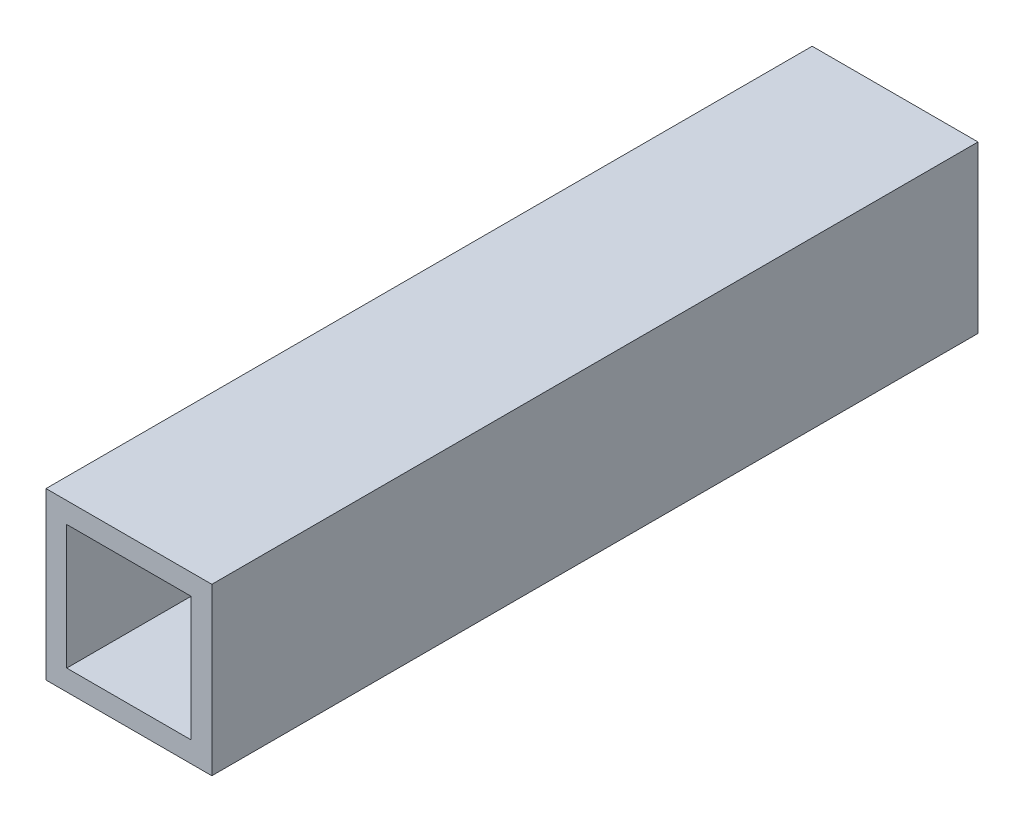
ISO-10303-21;
HEADER;
FILE_DESCRIPTION(('STEP AP214'),'2;1');
FILE_NAME('part.step','',(''),(''),'','','');
FILE_SCHEMA(('AUTOMOTIVE_DESIGN { 1 0 10303 214 1 1 1 1 }'));
ENDSEC;
DATA;
#1=APPLICATION_CONTEXT('core data for automotive mechanical design processes');
#2=APPLICATION_PROTOCOL_DEFINITION('international standard','automotive_design',2000,#1);
#3=PRODUCT_CONTEXT('',#1,'mechanical');
#4=PRODUCT('Part','Part','',(#3));
#5=PRODUCT_RELATED_PRODUCT_CATEGORY('part','',(#4));
#6=PRODUCT_DEFINITION_FORMATION('','',#4);
#7=PRODUCT_DEFINITION_CONTEXT('part definition',#1,'design');
#8=PRODUCT_DEFINITION('design','',#6,#7);
#9=PRODUCT_DEFINITION_SHAPE('','',#8);
#10=(LENGTH_UNIT() NAMED_UNIT(*) SI_UNIT(.MILLI.,.METRE.));
#11=(NAMED_UNIT(*) PLANE_ANGLE_UNIT() SI_UNIT($,.RADIAN.));
#12=(NAMED_UNIT(*) SI_UNIT($,.STERADIAN.) SOLID_ANGLE_UNIT());
#13=UNCERTAINTY_MEASURE_WITH_UNIT(LENGTH_MEASURE(1.E-05),#10,'distance_accuracy_value','');
#14=(GEOMETRIC_REPRESENTATION_CONTEXT(3) GLOBAL_UNCERTAINTY_ASSIGNED_CONTEXT((#13)) GLOBAL_UNIT_ASSIGNED_CONTEXT((#10,
#11,#12)) REPRESENTATION_CONTEXT('',''));
#15=CARTESIAN_POINT('',(0.,0.,0.));
#16=DIRECTION('',(0.,0.,1.));
#17=DIRECTION('',(1.,0.,0.));
#18=AXIS2_PLACEMENT_3D('',#15,#16,#17);
#19=CARTESIAN_POINT('',(0.,0.,58.674));
#20=DIRECTION('',(0.,0.,1.));
#21=DIRECTION('',(1.,0.,0.));
#22=AXIS2_PLACEMENT_3D('',#19,#20,#21);
#23=PLANE('',#22);
#24=DIRECTION('',(0.,-1.,0.));
#25=VECTOR('',#24,1.);
#26=CARTESIAN_POINT('',(-12.7,-12.7,58.674));
#27=LINE('',#26,#25);
#28=CARTESIAN_POINT('',(-12.7,12.7,58.674));
#29=VERTEX_POINT('',#28);
#30=CARTESIAN_POINT('',(-12.7,-12.7,58.674));
#31=VERTEX_POINT('',#30);
#32=EDGE_CURVE('E117',#29,#31,#27,.T.);
#33=ORIENTED_EDGE('',*,*,#32,.T.);
#34=DIRECTION('',(1.,0.,0.));
#35=VECTOR('',#34,1.);
#36=CARTESIAN_POINT('',(12.7,-12.7,58.674));
#37=LINE('',#36,#35);
#38=CARTESIAN_POINT('',(12.7,-12.7,58.674));
#39=VERTEX_POINT('',#38);
#40=EDGE_CURVE('E176',#31,#39,#37,.T.);
#41=ORIENTED_EDGE('',*,*,#40,.T.);
#42=DIRECTION('',(0.,1.,0.));
#43=VECTOR('',#42,1.);
#44=CARTESIAN_POINT('',(12.7,-12.7,58.674));
#45=LINE('',#44,#43);
#46=CARTESIAN_POINT('',(12.7,12.7,58.674));
#47=VERTEX_POINT('',#46);
#48=EDGE_CURVE('E179',#39,#47,#45,.T.);
#49=ORIENTED_EDGE('',*,*,#48,.T.);
#50=DIRECTION('',(-1.,0.,0.));
#51=VECTOR('',#50,1.);
#52=CARTESIAN_POINT('',(12.7,12.7,58.674));
#53=LINE('',#52,#51);
#54=EDGE_CURVE('E63',#47,#29,#53,.T.);
#55=ORIENTED_EDGE('',*,*,#54,.T.);
#56=EDGE_LOOP('',(#33,#41,#49,#55));
#57=FACE_BOUND('',#56,.T.);
#58=DIRECTION('',(1.,0.,0.));
#59=VECTOR('',#58,1.);
#60=CARTESIAN_POINT('',(9.525,-9.525,58.674));
#61=LINE('',#60,#59);
#62=CARTESIAN_POINT('',(-9.52499999999999,-9.525,58.674));
#63=VERTEX_POINT('',#62);
#64=CARTESIAN_POINT('',(9.525,-9.525,58.674));
#65=VERTEX_POINT('',#64);
#66=EDGE_CURVE('E158',#63,#65,#61,.T.);
#67=ORIENTED_EDGE('',*,*,#66,.F.);
#68=DIRECTION('',(0.,-1.,0.));
#69=VECTOR('',#68,1.);
#70=CARTESIAN_POINT('',(-9.52499999999999,-9.525,58.674));
#71=LINE('',#70,#69);
#72=CARTESIAN_POINT('',(-9.52499999999999,9.525,58.674));
#73=VERTEX_POINT('',#72);
#74=EDGE_CURVE('E113',#73,#63,#71,.T.);
#75=ORIENTED_EDGE('',*,*,#74,.F.);
#76=DIRECTION('',(-1.,0.,0.));
#77=VECTOR('',#76,1.);
#78=CARTESIAN_POINT('',(9.525,9.525,58.674));
#79=LINE('',#78,#77);
#80=CARTESIAN_POINT('',(9.525,9.525,58.674));
#81=VERTEX_POINT('',#80);
#82=EDGE_CURVE('E164',#81,#73,#79,.T.);
#83=ORIENTED_EDGE('',*,*,#82,.F.);
#84=DIRECTION('',(0.,1.,0.));
#85=VECTOR('',#84,1.);
#86=CARTESIAN_POINT('',(9.525,-9.525,58.674));
#87=LINE('',#86,#85);
#88=EDGE_CURVE('E161',#65,#81,#87,.T.);
#89=ORIENTED_EDGE('',*,*,#88,.F.);
#90=EDGE_LOOP('',(#67,#75,#83,#89));
#91=FACE_BOUND('',#90,.T.);
#92=ADVANCED_FACE('F39',(#57,#91),#23,.T.);
#93=CARTESIAN_POINT('',(-12.7,-12.7,58.674));
#94=DIRECTION('',(1.,0.,0.));
#95=DIRECTION('',(0.,0.,-1.));
#96=AXIS2_PLACEMENT_3D('',#93,#94,#95);
#97=PLANE('',#96);
#98=DIRECTION('',(0.,0.,-1.));
#99=VECTOR('',#98,1.);
#100=CARTESIAN_POINT('',(-12.7,12.7,58.674));
#101=LINE('',#100,#99);
#102=CARTESIAN_POINT('',(-12.7,12.7,-58.674));
#103=VERTEX_POINT('',#102);
#104=EDGE_CURVE('E184',#29,#103,#101,.T.);
#105=ORIENTED_EDGE('',*,*,#104,.T.);
#106=DIRECTION('',(0.,-1.,0.));
#107=VECTOR('',#106,1.);
#108=CARTESIAN_POINT('',(-12.7,-12.7,-58.674));
#109=LINE('',#108,#107);
#110=CARTESIAN_POINT('',(-12.7,-12.7,-58.674));
#111=VERTEX_POINT('',#110);
#112=EDGE_CURVE('E140',#103,#111,#109,.T.);
#113=ORIENTED_EDGE('',*,*,#112,.T.);
#114=DIRECTION('',(0.,0.,-1.));
#115=VECTOR('',#114,1.);
#116=CARTESIAN_POINT('',(-12.7,-12.7,58.674));
#117=LINE('',#116,#115);
#118=EDGE_CURVE('E11',#31,#111,#117,.T.);
#119=ORIENTED_EDGE('',*,*,#118,.F.);
#120=ORIENTED_EDGE('',*,*,#32,.F.);
#121=EDGE_LOOP('',(#105,#113,#119,#120));
#122=FACE_BOUND('',#121,.T.);
#123=ADVANCED_FACE('F41',(#122),#97,.F.);
#124=CARTESIAN_POINT('',(12.7,-12.7,58.674));
#125=DIRECTION('',(0.,1.,0.));
#126=DIRECTION('',(0.,0.,1.));
#127=AXIS2_PLACEMENT_3D('',#124,#125,#126);
#128=PLANE('',#127);
#129=ORIENTED_EDGE('',*,*,#118,.T.);
#130=DIRECTION('',(1.,0.,0.));
#131=VECTOR('',#130,1.);
#132=CARTESIAN_POINT('',(12.7,-12.7,-58.674));
#133=LINE('',#132,#131);
#134=CARTESIAN_POINT('',(12.7,-12.7,-58.674));
#135=VERTEX_POINT('',#134);
#136=EDGE_CURVE('E144',#111,#135,#133,.T.);
#137=ORIENTED_EDGE('',*,*,#136,.T.);
#138=DIRECTION('',(0.,0.,-1.));
#139=VECTOR('',#138,1.);
#140=CARTESIAN_POINT('',(12.7,-12.7,58.674));
#141=LINE('',#140,#139);
#142=EDGE_CURVE('E48',#39,#135,#141,.T.);
#143=ORIENTED_EDGE('',*,*,#142,.F.);
#144=ORIENTED_EDGE('',*,*,#40,.F.);
#145=EDGE_LOOP('',(#129,#137,#143,#144));
#146=FACE_BOUND('',#145,.T.);
#147=ADVANCED_FACE('F200',(#146),#128,.F.);
#148=CARTESIAN_POINT('',(12.7,-12.7,58.674));
#149=DIRECTION('',(-1.,0.,0.));
#150=DIRECTION('',(0.,0.,1.));
#151=AXIS2_PLACEMENT_3D('',#148,#149,#150);
#152=PLANE('',#151);
#153=ORIENTED_EDGE('',*,*,#142,.T.);
#154=DIRECTION('',(0.,1.,0.));
#155=VECTOR('',#154,1.);
#156=CARTESIAN_POINT('',(12.7,-12.7,-58.674));
#157=LINE('',#156,#155);
#158=CARTESIAN_POINT('',(12.7,12.7,-58.674));
#159=VERTEX_POINT('',#158);
#160=EDGE_CURVE('E148',#135,#159,#157,.T.);
#161=ORIENTED_EDGE('',*,*,#160,.T.);
#162=DIRECTION('',(0.,0.,-1.));
#163=VECTOR('',#162,1.);
#164=CARTESIAN_POINT('',(12.7,12.7,58.674));
#165=LINE('',#164,#163);
#166=EDGE_CURVE('E187',#47,#159,#165,.T.);
#167=ORIENTED_EDGE('',*,*,#166,.F.);
#168=ORIENTED_EDGE('',*,*,#48,.F.);
#169=EDGE_LOOP('',(#153,#161,#167,#168));
#170=FACE_BOUND('',#169,.T.);
#171=ADVANCED_FACE('F194',(#170),#152,.F.);
#172=CARTESIAN_POINT('',(12.7,12.7,58.674));
#173=DIRECTION('',(0.,-1.,0.));
#174=DIRECTION('',(0.,0.,-1.));
#175=AXIS2_PLACEMENT_3D('',#172,#173,#174);
#176=PLANE('',#175);
#177=ORIENTED_EDGE('',*,*,#166,.T.);
#178=DIRECTION('',(-1.,0.,0.));
#179=VECTOR('',#178,1.);
#180=CARTESIAN_POINT('',(12.7,12.7,-58.674));
#181=LINE('',#180,#179);
#182=EDGE_CURVE('E152',#159,#103,#181,.T.);
#183=ORIENTED_EDGE('',*,*,#182,.T.);
#184=ORIENTED_EDGE('',*,*,#104,.F.);
#185=ORIENTED_EDGE('',*,*,#54,.F.);
#186=EDGE_LOOP('',(#177,#183,#184,#185));
#187=FACE_BOUND('',#186,.T.);
#188=ADVANCED_FACE('F205',(#187),#176,.F.);
#189=CARTESIAN_POINT('',(-9.52499999999999,-9.525,58.674));
#190=DIRECTION('',(1.,0.,0.));
#191=DIRECTION('',(0.,0.,-1.));
#192=AXIS2_PLACEMENT_3D('',#189,#190,#191);
#193=PLANE('',#192);
#194=DIRECTION('',(0.,0.,-1.));
#195=VECTOR('',#194,1.);
#196=CARTESIAN_POINT('',(-9.52499999999999,-9.525,58.674));
#197=LINE('',#196,#195);
#198=CARTESIAN_POINT('',(-9.52499999999999,-9.525,-58.674));
#199=VERTEX_POINT('',#198);
#200=EDGE_CURVE('E105',#63,#199,#197,.T.);
#201=ORIENTED_EDGE('',*,*,#200,.T.);
#202=DIRECTION('',(0.,-1.,0.));
#203=VECTOR('',#202,1.);
#204=CARTESIAN_POINT('',(-9.52499999999999,-9.525,-58.674));
#205=LINE('',#204,#203);
#206=CARTESIAN_POINT('',(-9.52499999999999,9.525,-58.674));
#207=VERTEX_POINT('',#206);
#208=EDGE_CURVE('E110',#207,#199,#205,.T.);
#209=ORIENTED_EDGE('',*,*,#208,.F.);
#210=DIRECTION('',(0.,0.,-1.));
#211=VECTOR('',#210,1.);
#212=CARTESIAN_POINT('',(-9.52499999999999,9.525,58.674));
#213=LINE('',#212,#211);
#214=EDGE_CURVE('E167',#73,#207,#213,.T.);
#215=ORIENTED_EDGE('',*,*,#214,.F.);
#216=ORIENTED_EDGE('',*,*,#74,.T.);
#217=EDGE_LOOP('',(#201,#209,#215,#216));
#218=FACE_BOUND('',#217,.T.);
#219=ADVANCED_FACE('F107',(#218),#193,.T.);
#220=CARTESIAN_POINT('',(9.525,-9.525,58.674));
#221=DIRECTION('',(0.,1.,0.));
#222=DIRECTION('',(0.,0.,1.));
#223=AXIS2_PLACEMENT_3D('',#220,#221,#222);
#224=PLANE('',#223);
#225=DIRECTION('',(0.,0.,-1.));
#226=VECTOR('',#225,1.);
#227=CARTESIAN_POINT('',(9.525,-9.525,58.674));
#228=LINE('',#227,#226);
#229=CARTESIAN_POINT('',(9.525,-9.525,-58.674));
#230=VERTEX_POINT('',#229);
#231=EDGE_CURVE('E118',#65,#230,#228,.T.);
#232=ORIENTED_EDGE('',*,*,#231,.T.);
#233=DIRECTION('',(1.,0.,0.));
#234=VECTOR('',#233,1.);
#235=CARTESIAN_POINT('',(9.525,-9.525,-58.674));
#236=LINE('',#235,#234);
#237=EDGE_CURVE('E121',#199,#230,#236,.T.);
#238=ORIENTED_EDGE('',*,*,#237,.F.);
#239=ORIENTED_EDGE('',*,*,#200,.F.);
#240=ORIENTED_EDGE('',*,*,#66,.T.);
#241=EDGE_LOOP('',(#232,#238,#239,#240));
#242=FACE_BOUND('',#241,.T.);
#243=ADVANCED_FACE('F122',(#242),#224,.T.);
#244=CARTESIAN_POINT('',(9.525,-9.525,58.674));
#245=DIRECTION('',(-1.,0.,0.));
#246=DIRECTION('',(0.,0.,1.));
#247=AXIS2_PLACEMENT_3D('',#244,#245,#246);
#248=PLANE('',#247);
#249=DIRECTION('',(0.,0.,-1.));
#250=VECTOR('',#249,1.);
#251=CARTESIAN_POINT('',(9.525,9.525,58.674));
#252=LINE('',#251,#250);
#253=CARTESIAN_POINT('',(9.525,9.525,-58.674));
#254=VERTEX_POINT('',#253);
#255=EDGE_CURVE('E55',#81,#254,#252,.T.);
#256=ORIENTED_EDGE('',*,*,#255,.T.);
#257=DIRECTION('',(0.,1.,0.));
#258=VECTOR('',#257,1.);
#259=CARTESIAN_POINT('',(9.525,-9.525,-58.674));
#260=LINE('',#259,#258);
#261=EDGE_CURVE('E128',#230,#254,#260,.T.);
#262=ORIENTED_EDGE('',*,*,#261,.F.);
#263=ORIENTED_EDGE('',*,*,#231,.F.);
#264=ORIENTED_EDGE('',*,*,#88,.T.);
#265=EDGE_LOOP('',(#256,#262,#263,#264));
#266=FACE_BOUND('',#265,.T.);
#267=ADVANCED_FACE('F223',(#266),#248,.T.);
#268=CARTESIAN_POINT('',(9.525,9.525,58.674));
#269=DIRECTION('',(0.,-1.,0.));
#270=DIRECTION('',(0.,0.,-1.));
#271=AXIS2_PLACEMENT_3D('',#268,#269,#270);
#272=PLANE('',#271);
#273=ORIENTED_EDGE('',*,*,#214,.T.);
#274=DIRECTION('',(-1.,0.,0.));
#275=VECTOR('',#274,1.);
#276=CARTESIAN_POINT('',(9.525,9.525,-58.674));
#277=LINE('',#276,#275);
#278=EDGE_CURVE('E132',#254,#207,#277,.T.);
#279=ORIENTED_EDGE('',*,*,#278,.F.);
#280=ORIENTED_EDGE('',*,*,#255,.F.);
#281=ORIENTED_EDGE('',*,*,#82,.T.);
#282=EDGE_LOOP('',(#273,#279,#280,#281));
#283=FACE_BOUND('',#282,.T.);
#284=ADVANCED_FACE('F226',(#283),#272,.T.);
#285=CARTESIAN_POINT('',(0.,0.,-58.674));
#286=DIRECTION('',(0.,0.,1.));
#287=DIRECTION('',(1.,0.,0.));
#288=AXIS2_PLACEMENT_3D('',#285,#286,#287);
#289=PLANE('',#288);
#290=ORIENTED_EDGE('',*,*,#278,.T.);
#291=ORIENTED_EDGE('',*,*,#208,.T.);
#292=ORIENTED_EDGE('',*,*,#237,.T.);
#293=ORIENTED_EDGE('',*,*,#261,.T.);
#294=EDGE_LOOP('',(#290,#291,#292,#293));
#295=FACE_BOUND('',#294,.T.);
#296=ORIENTED_EDGE('',*,*,#112,.F.);
#297=ORIENTED_EDGE('',*,*,#182,.F.);
#298=ORIENTED_EDGE('',*,*,#160,.F.);
#299=ORIENTED_EDGE('',*,*,#136,.F.);
#300=EDGE_LOOP('',(#296,#297,#298,#299));
#301=FACE_BOUND('',#300,.T.);
#302=ADVANCED_FACE('F130',(#295,#301),#289,.F.);
#303=CLOSED_SHELL('',(#92,#123,#147,#171,#188,#219,#243,#267,#284,#302));
#304=MANIFOLD_SOLID_BREP('B2',#303);
#305=ADVANCED_BREP_SHAPE_REPRESENTATION('',(#18,#304),#14);
#306=SHAPE_DEFINITION_REPRESENTATION(#9,#305);
ENDSEC;
END-ISO-10303-21;
